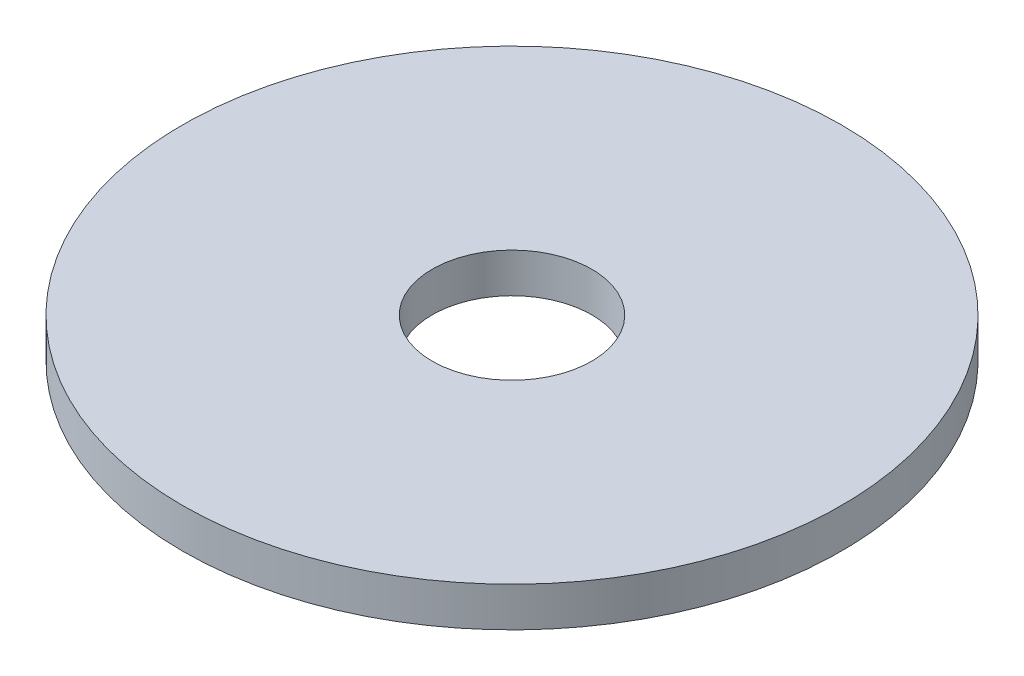
ISO-10303-21;
HEADER;
FILE_DESCRIPTION(('STEP AP214'),'2;1');
FILE_NAME('part.step','',(''),(''),'','','');
FILE_SCHEMA(('AUTOMOTIVE_DESIGN { 1 0 10303 214 1 1 1 1 }'));
ENDSEC;
DATA;
#1=APPLICATION_CONTEXT('core data for automotive mechanical design processes');
#2=APPLICATION_PROTOCOL_DEFINITION('international standard','automotive_design',2000,#1);
#3=PRODUCT_CONTEXT('',#1,'mechanical');
#4=PRODUCT('Part','Part','',(#3));
#5=PRODUCT_RELATED_PRODUCT_CATEGORY('part','',(#4));
#6=PRODUCT_DEFINITION_FORMATION('','',#4);
#7=PRODUCT_DEFINITION_CONTEXT('part definition',#1,'design');
#8=PRODUCT_DEFINITION('design','',#6,#7);
#9=PRODUCT_DEFINITION_SHAPE('','',#8);
#10=(LENGTH_UNIT() NAMED_UNIT(*) SI_UNIT(.MILLI.,.METRE.));
#11=(NAMED_UNIT(*) PLANE_ANGLE_UNIT() SI_UNIT($,.RADIAN.));
#12=(NAMED_UNIT(*) SI_UNIT($,.STERADIAN.) SOLID_ANGLE_UNIT());
#13=UNCERTAINTY_MEASURE_WITH_UNIT(LENGTH_MEASURE(1.E-05),#10,'distance_accuracy_value','');
#14=(GEOMETRIC_REPRESENTATION_CONTEXT(3) GLOBAL_UNCERTAINTY_ASSIGNED_CONTEXT((#13)) GLOBAL_UNIT_ASSIGNED_CONTEXT((#10,
#11,#12)) REPRESENTATION_CONTEXT('',''));
#15=CARTESIAN_POINT('',(0.,0.,0.));
#16=DIRECTION('',(0.,0.,1.));
#17=DIRECTION('',(1.,0.,0.));
#18=AXIS2_PLACEMENT_3D('',#15,#16,#17);
#19=CARTESIAN_POINT('',(0.,3.,0.));
#20=DIRECTION('',(0.,1.,0.));
#21=DIRECTION('',(0.,0.,1.));
#22=AXIS2_PLACEMENT_3D('',#19,#20,#21);
#23=PLANE('',#22);
#24=CARTESIAN_POINT('',(0.,3.,0.));
#25=DIRECTION('',(0.,1.,0.));
#26=DIRECTION('',(0.,0.,1.));
#27=AXIS2_PLACEMENT_3D('',#24,#25,#26);
#28=CIRCLE('',#27,25.);
#29=CARTESIAN_POINT('',(0.,3.,25.));
#30=VERTEX_POINT('',#29);
#31=EDGE_CURVE('E10',#30,#30,#28,.T.);
#32=ORIENTED_EDGE('',*,*,#31,.T.);
#33=EDGE_LOOP('',(#32));
#34=FACE_BOUND('',#33,.T.);
#35=CARTESIAN_POINT('',(0.,3.,0.));
#36=DIRECTION('',(0.,1.,0.));
#37=DIRECTION('',(0.,0.,1.));
#38=AXIS2_PLACEMENT_3D('',#35,#36,#37);
#39=CIRCLE('',#38,6.05);
#40=CARTESIAN_POINT('',(0.,3.,6.05));
#41=VERTEX_POINT('',#40);
#42=EDGE_CURVE('E54',#41,#41,#39,.T.);
#43=ORIENTED_EDGE('',*,*,#42,.F.);
#44=EDGE_LOOP('',(#43));
#45=FACE_BOUND('',#44,.T.);
#46=ADVANCED_FACE('F41',(#34,#45),#23,.T.);
#47=CARTESIAN_POINT('',(0.,0.,0.));
#48=DIRECTION('',(0.,1.,0.));
#49=DIRECTION('',(0.,0.,1.));
#50=AXIS2_PLACEMENT_3D('',#47,#48,#49);
#51=PLANE('',#50);
#52=CARTESIAN_POINT('',(0.,0.,0.));
#53=DIRECTION('',(0.,1.,0.));
#54=DIRECTION('',(0.,0.,1.));
#55=AXIS2_PLACEMENT_3D('',#52,#53,#54);
#56=CIRCLE('',#55,25.);
#57=CARTESIAN_POINT('',(0.,0.,25.));
#58=VERTEX_POINT('',#57);
#59=EDGE_CURVE('E45',#58,#58,#56,.T.);
#60=ORIENTED_EDGE('',*,*,#59,.F.);
#61=EDGE_LOOP('',(#60));
#62=FACE_BOUND('',#61,.T.);
#63=CARTESIAN_POINT('',(0.,0.,0.));
#64=DIRECTION('',(0.,1.,0.));
#65=DIRECTION('',(0.,0.,1.));
#66=AXIS2_PLACEMENT_3D('',#63,#64,#65);
#67=CIRCLE('',#66,6.05);
#68=CARTESIAN_POINT('',(0.,0.,6.05));
#69=VERTEX_POINT('',#68);
#70=EDGE_CURVE('E56',#69,#69,#67,.T.);
#71=ORIENTED_EDGE('',*,*,#70,.T.);
#72=EDGE_LOOP('',(#71));
#73=FACE_BOUND('',#72,.T.);
#74=ADVANCED_FACE('F68',(#62,#73),#51,.F.);
#75=CARTESIAN_POINT('',(0.,3.,0.));
#76=DIRECTION('',(0.,-1.,0.));
#77=DIRECTION('',(0.,0.,-1.));
#78=AXIS2_PLACEMENT_3D('',#75,#76,#77);
#79=CYLINDRICAL_SURFACE('',#78,25.);
#80=ORIENTED_EDGE('',*,*,#31,.F.);
#81=EDGE_LOOP('',(#80));
#82=FACE_BOUND('',#81,.T.);
#83=ORIENTED_EDGE('',*,*,#59,.T.);
#84=EDGE_LOOP('',(#83));
#85=FACE_BOUND('',#84,.T.);
#86=ADVANCED_FACE('F43',(#82,#85),#79,.T.);
#87=CARTESIAN_POINT('',(0.,3.,0.));
#88=DIRECTION('',(0.,-1.,0.));
#89=DIRECTION('',(0.,0.,-1.));
#90=AXIS2_PLACEMENT_3D('',#87,#88,#89);
#91=CYLINDRICAL_SURFACE('',#90,6.05);
#92=ORIENTED_EDGE('',*,*,#42,.T.);
#93=EDGE_LOOP('',(#92));
#94=FACE_BOUND('',#93,.T.);
#95=ORIENTED_EDGE('',*,*,#70,.F.);
#96=EDGE_LOOP('',(#95));
#97=FACE_BOUND('',#96,.T.);
#98=ADVANCED_FACE('F64',(#94,#97),#91,.F.);
#99=CLOSED_SHELL('',(#46,#74,#86,#98));
#100=MANIFOLD_SOLID_BREP('B2',#99);
#101=ADVANCED_BREP_SHAPE_REPRESENTATION('',(#18,#100),#14);
#102=SHAPE_DEFINITION_REPRESENTATION(#9,#101);
ENDSEC;
END-ISO-10303-21;
